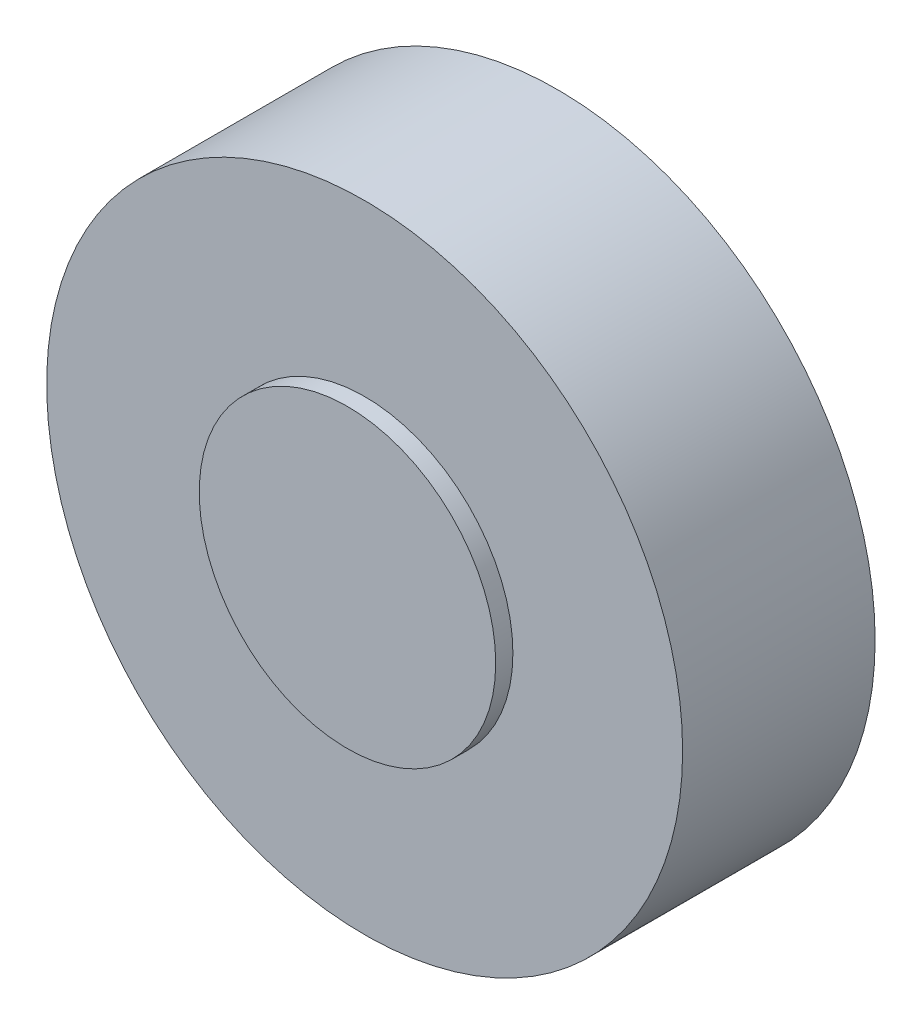
ISO-10303-21;
HEADER;
FILE_DESCRIPTION(('STEP AP214'),'2;1');
FILE_NAME('part.step','',(''),(''),'','','');
FILE_SCHEMA(('AUTOMOTIVE_DESIGN { 1 0 10303 214 1 1 1 1 }'));
ENDSEC;
DATA;
#1=APPLICATION_CONTEXT('core data for automotive mechanical design processes');
#2=APPLICATION_PROTOCOL_DEFINITION('international standard','automotive_design',2000,#1);
#3=PRODUCT_CONTEXT('',#1,'mechanical');
#4=PRODUCT('Part','Part','',(#3));
#5=PRODUCT_RELATED_PRODUCT_CATEGORY('part','',(#4));
#6=PRODUCT_DEFINITION_FORMATION('','',#4);
#7=PRODUCT_DEFINITION_CONTEXT('part definition',#1,'design');
#8=PRODUCT_DEFINITION('design','',#6,#7);
#9=PRODUCT_DEFINITION_SHAPE('','',#8);
#10=(LENGTH_UNIT() NAMED_UNIT(*) SI_UNIT(.MILLI.,.METRE.));
#11=(NAMED_UNIT(*) PLANE_ANGLE_UNIT() SI_UNIT($,.RADIAN.));
#12=(NAMED_UNIT(*) SI_UNIT($,.STERADIAN.) SOLID_ANGLE_UNIT());
#13=UNCERTAINTY_MEASURE_WITH_UNIT(LENGTH_MEASURE(1.E-05),#10,'distance_accuracy_value','');
#14=(GEOMETRIC_REPRESENTATION_CONTEXT(3) GLOBAL_UNCERTAINTY_ASSIGNED_CONTEXT((#13)) GLOBAL_UNIT_ASSIGNED_CONTEXT((#10,
#11,#12)) REPRESENTATION_CONTEXT('',''));
#15=CARTESIAN_POINT('',(0.,0.,0.));
#16=DIRECTION('',(0.,0.,1.));
#17=DIRECTION('',(1.,0.,0.));
#18=AXIS2_PLACEMENT_3D('',#15,#16,#17);
#19=CARTESIAN_POINT('',(0.,0.,44.8));
#20=DIRECTION('',(0.,0.,-1.));
#21=DIRECTION('',(-1.,0.,0.));
#22=AXIS2_PLACEMENT_3D('',#19,#20,#21);
#23=CYLINDRICAL_SURFACE('',#22,74.);
#24=CARTESIAN_POINT('',(0.,0.,44.8));
#25=DIRECTION('',(0.,0.,1.));
#26=DIRECTION('',(1.,0.,0.));
#27=AXIS2_PLACEMENT_3D('',#24,#25,#26);
#28=CIRCLE('',#27,74.);
#29=CARTESIAN_POINT('',(74.,0.,44.8));
#30=VERTEX_POINT('',#29);
#31=EDGE_CURVE('E45',#30,#30,#28,.T.);
#32=ORIENTED_EDGE('',*,*,#31,.F.);
#33=EDGE_LOOP('',(#32));
#34=FACE_BOUND('',#33,.T.);
#35=CARTESIAN_POINT('',(0.,0.,0.));
#36=DIRECTION('',(0.,0.,1.));
#37=DIRECTION('',(1.,0.,0.));
#38=AXIS2_PLACEMENT_3D('',#35,#36,#37);
#39=CIRCLE('',#38,74.);
#40=CARTESIAN_POINT('',(74.,0.,0.));
#41=VERTEX_POINT('',#40);
#42=EDGE_CURVE('E40',#41,#41,#39,.T.);
#43=ORIENTED_EDGE('',*,*,#42,.T.);
#44=EDGE_LOOP('',(#43));
#45=FACE_BOUND('',#44,.T.);
#46=ADVANCED_FACE('F37',(#34,#45),#23,.T.);
#47=CARTESIAN_POINT('',(0.,0.,44.8));
#48=DIRECTION('',(0.,0.,1.));
#49=DIRECTION('',(1.,0.,0.));
#50=AXIS2_PLACEMENT_3D('',#47,#48,#49);
#51=PLANE('',#50);
#52=CARTESIAN_POINT('',(0.,0.,44.8));
#53=DIRECTION('',(0.,0.,1.));
#54=DIRECTION('',(1.,0.,0.));
#55=AXIS2_PLACEMENT_3D('',#52,#53,#54);
#56=CIRCLE('',#55,34.5);
#57=CARTESIAN_POINT('',(34.5,0.,44.8));
#58=VERTEX_POINT('',#57);
#59=EDGE_CURVE('E11',#58,#58,#56,.T.);
#60=ORIENTED_EDGE('',*,*,#59,.F.);
#61=EDGE_LOOP('',(#60));
#62=FACE_BOUND('',#61,.T.);
#63=ORIENTED_EDGE('',*,*,#31,.T.);
#64=EDGE_LOOP('',(#63));
#65=FACE_BOUND('',#64,.T.);
#66=ADVANCED_FACE('F128',(#62,#65),#51,.T.);
#67=CARTESIAN_POINT('',(0.,0.,0.));
#68=DIRECTION('',(0.,0.,1.));
#69=DIRECTION('',(1.,0.,0.));
#70=AXIS2_PLACEMENT_3D('',#67,#68,#69);
#71=PLANE('',#70);
#72=DIRECTION('',(0.97891238514148,0.204280547817501,0.));
#73=VECTOR('',#72,1.);
#74=CARTESIAN_POINT('',(55.4545665142549,11.5723218936256,0.));
#75=LINE('',#74,#73);
#76=CARTESIAN_POINT('',(0.,0.,0.));
#77=VERTEX_POINT('',#76);
#78=CARTESIAN_POINT('',(55.4545665142549,11.5723218936256,0.));
#79=VERTEX_POINT('',#78);
#80=EDGE_CURVE('E88',#77,#79,#75,.T.);
#81=ORIENTED_EDGE('',*,*,#80,.F.);
#82=DIRECTION('',(-0.9838436198538,0.179029974230494,0.));
#83=VECTOR('',#82,1.);
#84=CARTESIAN_POINT('',(0.,0.,0.));
#85=LINE('',#84,#83);
#86=CARTESIAN_POINT('',(56.6507134708381,-10.3087274930241,0.));
#87=VERTEX_POINT('',#86);
#88=EDGE_CURVE('E53',#87,#77,#85,.T.);
#89=ORIENTED_EDGE('',*,*,#88,.F.);
#90=DIRECTION('',(0.569089186411711,-0.822275804039774,0.));
#91=VECTOR('',#90,1.);
#92=CARTESIAN_POINT('',(56.6507134708381,-10.3087274930241,0.));
#93=LINE('',#92,#91);
#94=CARTESIAN_POINT('',(48.9576461245236,0.806969815528148,0.));
#95=VERTEX_POINT('',#94);
#96=EDGE_CURVE('E104',#95,#87,#93,.T.);
#97=ORIENTED_EDGE('',*,*,#96,.F.);
#98=DIRECTION('',(-0.516699203484276,-0.856167000718152,0.));
#99=VECTOR('',#98,1.);
#100=CARTESIAN_POINT('',(48.9576461245236,0.806969815528148,0.));
#101=LINE('',#100,#99);
#102=EDGE_CURVE('E110',#79,#95,#101,.T.);
#103=ORIENTED_EDGE('',*,*,#102,.F.);
#104=EDGE_LOOP('',(#81,#89,#97,#103));
#105=FACE_BOUND('',#104,.T.);
#106=ORIENTED_EDGE('',*,*,#42,.F.);
#107=EDGE_LOOP('',(#106));
#108=FACE_BOUND('',#107,.T.);
#109=ADVANCED_FACE('F125',(#105,#108),#71,.F.);
#110=CARTESIAN_POINT('',(0.,0.,48.8));
#111=DIRECTION('',(0.,0.,-1.));
#112=DIRECTION('',(-1.,0.,0.));
#113=AXIS2_PLACEMENT_3D('',#110,#111,#112);
#114=CYLINDRICAL_SURFACE('',#113,34.5);
#115=CARTESIAN_POINT('',(0.,0.,48.8));
#116=DIRECTION('',(0.,0.,1.));
#117=DIRECTION('',(1.,0.,0.));
#118=AXIS2_PLACEMENT_3D('',#115,#116,#117);
#119=CIRCLE('',#118,34.5);
#120=CARTESIAN_POINT('',(34.5,0.,48.8));
#121=VERTEX_POINT('',#120);
#122=EDGE_CURVE('E114',#121,#121,#119,.T.);
#123=ORIENTED_EDGE('',*,*,#122,.F.);
#124=EDGE_LOOP('',(#123));
#125=FACE_BOUND('',#124,.T.);
#126=ORIENTED_EDGE('',*,*,#59,.T.);
#127=EDGE_LOOP('',(#126));
#128=FACE_BOUND('',#127,.T.);
#129=ADVANCED_FACE('F127',(#125,#128),#114,.T.);
#130=CARTESIAN_POINT('',(0.,0.,48.8));
#131=DIRECTION('',(0.,0.,1.));
#132=DIRECTION('',(1.,0.,0.));
#133=AXIS2_PLACEMENT_3D('',#130,#131,#132);
#134=PLANE('',#133);
#135=ORIENTED_EDGE('',*,*,#122,.T.);
#136=EDGE_LOOP('',(#135));
#137=FACE_BOUND('',#136,.T.);
#138=ADVANCED_FACE('F134',(#137),#134,.T.);
#139=CARTESIAN_POINT('',(0.,0.,4.));
#140=DIRECTION('',(-0.179029974230494,-0.9838436198538,0.));
#141=DIRECTION('',(0.9838436198538,-0.179029974230494,0.));
#142=AXIS2_PLACEMENT_3D('',#139,#140,#141);
#143=PLANE('',#142);
#144=ORIENTED_EDGE('',*,*,#88,.T.);
#145=DIRECTION('',(0.,0.,-1.));
#146=VECTOR('',#145,1.);
#147=CARTESIAN_POINT('',(0.,0.,4.));
#148=LINE('',#147,#146);
#149=CARTESIAN_POINT('',(0.,0.,4.));
#150=VERTEX_POINT('',#149);
#151=EDGE_CURVE('E76',#150,#77,#148,.T.);
#152=ORIENTED_EDGE('',*,*,#151,.F.);
#153=DIRECTION('',(-0.9838436198538,0.179029974230494,0.));
#154=VECTOR('',#153,1.);
#155=CARTESIAN_POINT('',(0.,0.,4.));
#156=LINE('',#155,#154);
#157=CARTESIAN_POINT('',(56.6507134708381,-10.3087274930241,4.));
#158=VERTEX_POINT('',#157);
#159=EDGE_CURVE('E102',#158,#150,#156,.T.);
#160=ORIENTED_EDGE('',*,*,#159,.F.);
#161=DIRECTION('',(0.,0.,-1.));
#162=VECTOR('',#161,1.);
#163=CARTESIAN_POINT('',(56.6507134708381,-10.3087274930241,4.));
#164=LINE('',#163,#162);
#165=EDGE_CURVE('E61',#158,#87,#164,.T.);
#166=ORIENTED_EDGE('',*,*,#165,.T.);
#167=EDGE_LOOP('',(#144,#152,#160,#166));
#168=FACE_BOUND('',#167,.T.);
#169=ADVANCED_FACE('F162',(#168),#143,.F.);
#170=CARTESIAN_POINT('',(56.6507134708381,-10.3087274930241,4.));
#171=DIRECTION('',(0.822275804039774,0.569089186411711,0.));
#172=DIRECTION('',(-0.569089186411711,0.822275804039774,0.));
#173=AXIS2_PLACEMENT_3D('',#170,#171,#172);
#174=PLANE('',#173);
#175=ORIENTED_EDGE('',*,*,#96,.T.);
#176=ORIENTED_EDGE('',*,*,#165,.F.);
#177=DIRECTION('',(0.569089186411711,-0.822275804039774,0.));
#178=VECTOR('',#177,1.);
#179=CARTESIAN_POINT('',(56.6507134708381,-10.3087274930241,4.));
#180=LINE('',#179,#178);
#181=CARTESIAN_POINT('',(48.9576461245236,0.806969815528148,4.));
#182=VERTEX_POINT('',#181);
#183=EDGE_CURVE('E99',#182,#158,#180,.T.);
#184=ORIENTED_EDGE('',*,*,#183,.F.);
#185=DIRECTION('',(0.,0.,-1.));
#186=VECTOR('',#185,1.);
#187=CARTESIAN_POINT('',(48.9576461245236,0.806969815528148,4.));
#188=LINE('',#187,#186);
#189=EDGE_CURVE('E92',#182,#95,#188,.T.);
#190=ORIENTED_EDGE('',*,*,#189,.T.);
#191=EDGE_LOOP('',(#175,#176,#184,#190));
#192=FACE_BOUND('',#191,.T.);
#193=ADVANCED_FACE('F176',(#192),#174,.F.);
#194=CARTESIAN_POINT('',(48.9576461245236,0.806969815528148,4.));
#195=DIRECTION('',(0.856167000718152,-0.516699203484276,0.));
#196=DIRECTION('',(0.516699203484276,0.856167000718152,0.));
#197=AXIS2_PLACEMENT_3D('',#194,#195,#196);
#198=PLANE('',#197);
#199=ORIENTED_EDGE('',*,*,#102,.T.);
#200=ORIENTED_EDGE('',*,*,#189,.F.);
#201=DIRECTION('',(-0.516699203484276,-0.856167000718152,0.));
#202=VECTOR('',#201,1.);
#203=CARTESIAN_POINT('',(48.9576461245236,0.806969815528148,4.));
#204=LINE('',#203,#202);
#205=CARTESIAN_POINT('',(55.4545665142549,11.5723218936256,4.));
#206=VERTEX_POINT('',#205);
#207=EDGE_CURVE('E95',#206,#182,#204,.T.);
#208=ORIENTED_EDGE('',*,*,#207,.F.);
#209=DIRECTION('',(0.,0.,-1.));
#210=VECTOR('',#209,1.);
#211=CARTESIAN_POINT('',(55.4545665142549,11.5723218936256,4.));
#212=LINE('',#211,#210);
#213=EDGE_CURVE('E81',#206,#79,#212,.T.);
#214=ORIENTED_EDGE('',*,*,#213,.T.);
#215=EDGE_LOOP('',(#199,#200,#208,#214));
#216=FACE_BOUND('',#215,.T.);
#217=ADVANCED_FACE('F96',(#216),#198,.F.);
#218=CARTESIAN_POINT('',(55.4545665142549,11.5723218936256,4.));
#219=DIRECTION('',(-0.204280547817501,0.97891238514148,0.));
#220=DIRECTION('',(-0.97891238514148,-0.204280547817501,0.));
#221=AXIS2_PLACEMENT_3D('',#218,#219,#220);
#222=PLANE('',#221);
#223=ORIENTED_EDGE('',*,*,#80,.T.);
#224=ORIENTED_EDGE('',*,*,#213,.F.);
#225=DIRECTION('',(0.97891238514148,0.204280547817501,0.));
#226=VECTOR('',#225,1.);
#227=CARTESIAN_POINT('',(55.4545665142549,11.5723218936256,4.));
#228=LINE('',#227,#226);
#229=EDGE_CURVE('E85',#150,#206,#228,.T.);
#230=ORIENTED_EDGE('',*,*,#229,.F.);
#231=ORIENTED_EDGE('',*,*,#151,.T.);
#232=EDGE_LOOP('',(#223,#224,#230,#231));
#233=FACE_BOUND('',#232,.T.);
#234=ADVANCED_FACE('F83',(#233),#222,.F.);
#235=CARTESIAN_POINT('',(0.,0.,4.));
#236=DIRECTION('',(0.,0.,1.));
#237=DIRECTION('',(0.,-1.,0.));
#238=AXIS2_PLACEMENT_3D('',#235,#236,#237);
#239=PLANE('',#238);
#240=ORIENTED_EDGE('',*,*,#159,.T.);
#241=ORIENTED_EDGE('',*,*,#229,.T.);
#242=ORIENTED_EDGE('',*,*,#207,.T.);
#243=ORIENTED_EDGE('',*,*,#183,.T.);
#244=EDGE_LOOP('',(#240,#241,#242,#243));
#245=FACE_BOUND('',#244,.T.);
#246=ADVANCED_FACE('F101',(#245),#239,.F.);
#247=CLOSED_SHELL('',(#46,#66,#109,#129,#138,#169,#193,#217,#234,#246));
#248=MANIFOLD_SOLID_BREP('B2',#247);
#249=ADVANCED_BREP_SHAPE_REPRESENTATION('',(#18,#248),#14);
#250=SHAPE_DEFINITION_REPRESENTATION(#9,#249);
ENDSEC;
END-ISO-10303-21;
